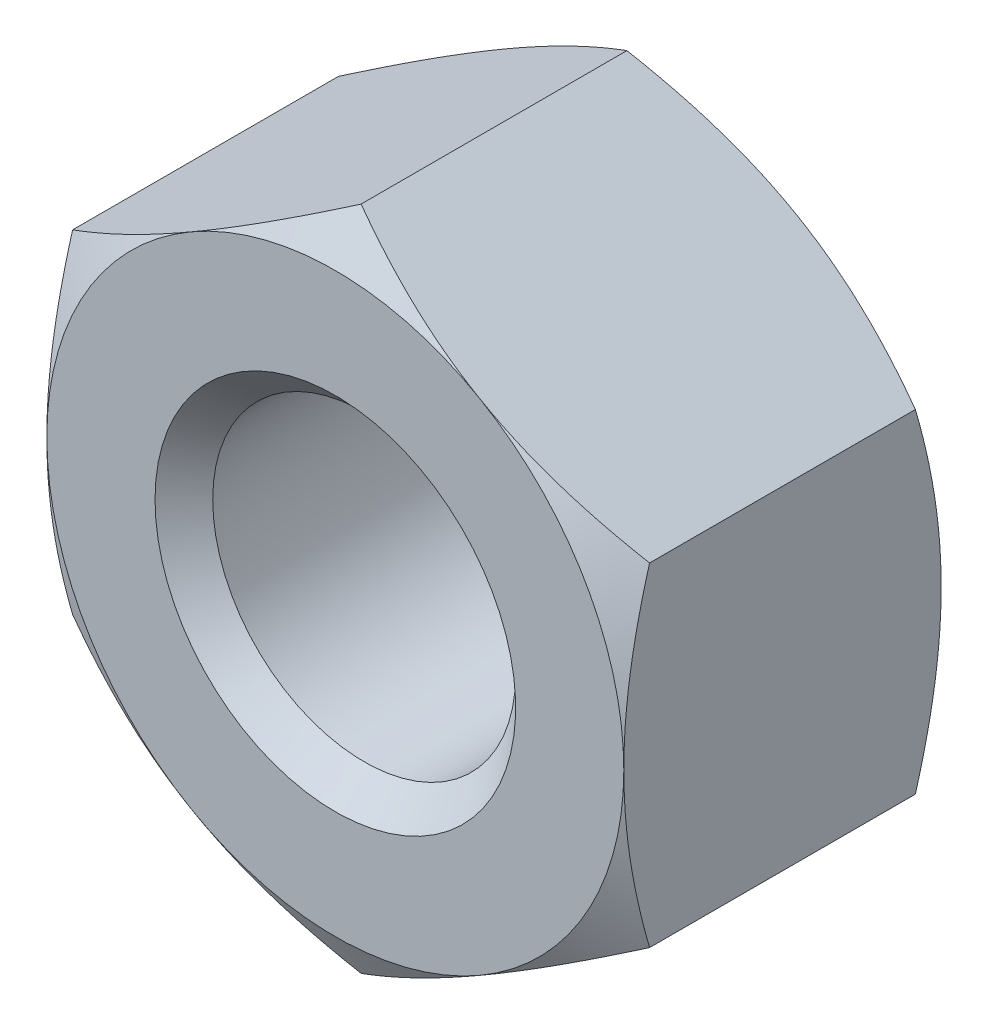
ISO-10303-21;
HEADER;
FILE_DESCRIPTION(('STEP AP214'),'2;1');
FILE_NAME('part.step','',(''),(''),'','','');
FILE_SCHEMA(('AUTOMOTIVE_DESIGN { 1 0 10303 214 1 1 1 1 }'));
ENDSEC;
DATA;
#1=APPLICATION_CONTEXT('core data for automotive mechanical design processes');
#2=APPLICATION_PROTOCOL_DEFINITION('international standard','automotive_design',2000,#1);
#3=PRODUCT_CONTEXT('',#1,'mechanical');
#4=PRODUCT('Part','Part','',(#3));
#5=PRODUCT_RELATED_PRODUCT_CATEGORY('part','',(#4));
#6=PRODUCT_DEFINITION_FORMATION('','',#4);
#7=PRODUCT_DEFINITION_CONTEXT('part definition',#1,'design');
#8=PRODUCT_DEFINITION('design','',#6,#7);
#9=PRODUCT_DEFINITION_SHAPE('','',#8);
#10=(LENGTH_UNIT() NAMED_UNIT(*) SI_UNIT(.MILLI.,.METRE.));
#11=(NAMED_UNIT(*) PLANE_ANGLE_UNIT() SI_UNIT($,.RADIAN.));
#12=(NAMED_UNIT(*) SI_UNIT($,.STERADIAN.) SOLID_ANGLE_UNIT());
#13=UNCERTAINTY_MEASURE_WITH_UNIT(LENGTH_MEASURE(1.E-05),#10,'distance_accuracy_value','');
#14=(GEOMETRIC_REPRESENTATION_CONTEXT(3) GLOBAL_UNCERTAINTY_ASSIGNED_CONTEXT((#13)) GLOBAL_UNIT_ASSIGNED_CONTEXT((#10,
#11,#12)) REPRESENTATION_CONTEXT('',''));
#15=CARTESIAN_POINT('',(0.,0.,0.));
#16=DIRECTION('',(0.,0.,1.));
#17=DIRECTION('',(1.,0.,0.));
#18=AXIS2_PLACEMENT_3D('',#15,#16,#17);
#19=CARTESIAN_POINT('',(0.,0.,0.));
#20=DIRECTION('',(0.,0.,1.));
#21=DIRECTION('',(-1.,0.,0.));
#22=AXIS2_PLACEMENT_3D('',#19,#20,#21);
#23=CONICAL_SURFACE('',#22,4.,1.0471975511966);
#24=CARTESIAN_POINT('',(-4.,0.,0.));
#25=CARTESIAN_POINT('',(-4.,1.07179676974714,0.));
#26=CARTESIAN_POINT('',(-4.,2.30940107681485,0.35726558992443));
#27=(BOUNDED_CURVE() B_SPLINE_CURVE(2,(#24,#25,#26),.UNSPECIFIED.,.F.,
.F.) B_SPLINE_CURVE_WITH_KNOTS((3,3),(1.38370732052329,1.88872631328208),
.UNSPECIFIED.) CURVE() GEOMETRIC_REPRESENTATION_ITEM() RATIONAL_B_SPLINE_CURVE((2.16913429510899,
2.16913429510899,2.01339745961497)) REPRESENTATION_ITEM(''));
#28=CARTESIAN_POINT('',(-4.,0.,0.));
#29=VERTEX_POINT('',#28);
#30=CARTESIAN_POINT('',(-4.,2.3094010767585,0.357265589908164));
#31=VERTEX_POINT('',#30);
#32=EDGE_CURVE('E28',#29,#31,#27,.T.);
#33=ORIENTED_EDGE('',*,*,#32,.T.);
#34=CARTESIAN_POINT('',(-3.99999999996844,2.30940107677673,0.357265589897643));
#35=CARTESIAN_POINT('',(-2.92820323026283,2.92820323028283,0.));
#36=CARTESIAN_POINT('',(-2.,3.46410161513775,0.));
#37=(BOUNDED_CURVE() B_SPLINE_CURVE(2,(#34,#35,#36),.UNSPECIFIED.,.F.,
.F.) B_SPLINE_CURVE_WITH_KNOTS((3,3),(0.878688327782084,1.38370732052329),
.UNSPECIFIED.) CURVE() GEOMETRIC_REPRESENTATION_ITEM() RATIONAL_B_SPLINE_CURVE((2.01339745962581,
2.16913429510899,2.16913429510899)) REPRESENTATION_ITEM(''));
#38=CARTESIAN_POINT('',(-2.,3.46410161513775,0.));
#39=VERTEX_POINT('',#38);
#40=EDGE_CURVE('E169',#31,#39,#37,.T.);
#41=ORIENTED_EDGE('',*,*,#40,.T.);
#42=CARTESIAN_POINT('',(0.,0.,0.));
#43=DIRECTION('',(0.,0.,-1.));
#44=DIRECTION('',(-1.,0.,0.));
#45=AXIS2_PLACEMENT_3D('',#42,#43,#44);
#46=CIRCLE('',#45,4.);
#47=EDGE_CURVE('E202',#29,#39,#46,.T.);
#48=ORIENTED_EDGE('',*,*,#47,.F.);
#49=EDGE_LOOP('',(#33,#41,#48));
#50=FACE_BOUND('',#49,.T.);
#51=ADVANCED_FACE('F17',(#50),#23,.T.);
#52=CARTESIAN_POINT('',(0.,0.,0.));
#53=DIRECTION('',(0.,0.,1.));
#54=DIRECTION('',(-1.,0.,0.));
#55=AXIS2_PLACEMENT_3D('',#52,#53,#54);
#56=CONICAL_SURFACE('',#55,4.,1.0471975511966);
#57=CARTESIAN_POINT('',(0.,0.,0.));
#58=DIRECTION('',(0.,0.,-1.));
#59=DIRECTION('',(-1.,0.,0.));
#60=AXIS2_PLACEMENT_3D('',#57,#58,#59);
#61=CIRCLE('',#60,4.);
#62=CARTESIAN_POINT('',(2.,3.46410161513775,0.));
#63=VERTEX_POINT('',#62);
#64=EDGE_CURVE('E246',#39,#63,#61,.T.);
#65=ORIENTED_EDGE('',*,*,#64,.F.);
#66=CARTESIAN_POINT('',(-2.,3.46410161513775,0.));
#67=CARTESIAN_POINT('',(-1.07179676970488,4.00000000001133,0.));
#68=CARTESIAN_POINT('',(4.88062024363408E-11,4.61880215354519,0.357265589924434));
#69=(BOUNDED_CURVE() B_SPLINE_CURVE(2,(#66,#67,#68),.UNSPECIFIED.,.F.,
.F.) B_SPLINE_CURVE_WITH_KNOTS((3,3),(1.38370732052329,1.88872631328208),
.UNSPECIFIED.) CURVE() GEOMETRIC_REPRESENTATION_ITEM() RATIONAL_B_SPLINE_CURVE((2.16913429510899,
2.16913429510899,2.01339745961497)) REPRESENTATION_ITEM(''));
#70=CARTESIAN_POINT('',(0.,4.61880215351701,0.357265589908166));
#71=VERTEX_POINT('',#70);
#72=EDGE_CURVE('E254',#39,#71,#69,.T.);
#73=ORIENTED_EDGE('',*,*,#72,.T.);
#74=CARTESIAN_POINT('',(3.15596208778348E-11,4.61880215349878,0.357265589897645));
#75=CARTESIAN_POINT('',(1.07179676973718,3.99999999999268,0.));
#76=CARTESIAN_POINT('',(2.,3.46410161513775,0.));
#77=(BOUNDED_CURVE() B_SPLINE_CURVE(2,(#74,#75,#76),.UNSPECIFIED.,.F.,
.F.) B_SPLINE_CURVE_WITH_KNOTS((3,3),(0.878688327782082,1.38370732052329),
.UNSPECIFIED.) CURVE() GEOMETRIC_REPRESENTATION_ITEM() RATIONAL_B_SPLINE_CURVE((2.01339745962582,
2.169134295109,2.169134295109)) REPRESENTATION_ITEM(''));
#78=EDGE_CURVE('E345',#71,#63,#77,.T.);
#79=ORIENTED_EDGE('',*,*,#78,.T.);
#80=EDGE_LOOP('',(#65,#73,#79));
#81=FACE_BOUND('',#80,.T.);
#82=ADVANCED_FACE('F597',(#81),#56,.T.);
#83=CARTESIAN_POINT('',(0.,0.,0.));
#84=DIRECTION('',(0.,0.,1.));
#85=DIRECTION('',(-1.,0.,0.));
#86=AXIS2_PLACEMENT_3D('',#83,#84,#85);
#87=CONICAL_SURFACE('',#86,4.,1.0471975511966);
#88=CARTESIAN_POINT('',(0.,0.,0.));
#89=DIRECTION('',(0.,0.,1.));
#90=DIRECTION('',(1.,0.,0.));
#91=AXIS2_PLACEMENT_3D('',#88,#89,#90);
#92=CIRCLE('',#91,4.);
#93=CARTESIAN_POINT('',(4.,0.,0.));
#94=VERTEX_POINT('',#93);
#95=EDGE_CURVE('E253',#94,#63,#92,.T.);
#96=ORIENTED_EDGE('',*,*,#95,.T.);
#97=CARTESIAN_POINT('',(2.,3.46410161513775,0.));
#98=CARTESIAN_POINT('',(2.92820323029512,2.92820323026418,0.));
#99=CARTESIAN_POINT('',(4.0000000000488,2.30940107673033,0.357265589924432));
#100=(BOUNDED_CURVE() B_SPLINE_CURVE(2,(#97,#98,#99),.UNSPECIFIED.,.F.,
.F.) B_SPLINE_CURVE_WITH_KNOTS((3,3),(1.38370732052329,1.88872631328208),
.UNSPECIFIED.) CURVE() GEOMETRIC_REPRESENTATION_ITEM() RATIONAL_B_SPLINE_CURVE((2.169134295109,
2.169134295109,2.01339745961498)) REPRESENTATION_ITEM(''));
#101=CARTESIAN_POINT('',(4.,2.30940107675851,0.357265589908166));
#102=VERTEX_POINT('',#101);
#103=EDGE_CURVE('E353',#63,#102,#100,.T.);
#104=ORIENTED_EDGE('',*,*,#103,.T.);
#105=CARTESIAN_POINT('',(4.,0.,0.));
#106=CARTESIAN_POINT('',(4.,1.07179676974714,0.));
#107=CARTESIAN_POINT('',(4.,2.30940107681485,0.357265589924431));
#108=(BOUNDED_CURVE() B_SPLINE_CURVE(2,(#105,#106,#107),.UNSPECIFIED.,.F.,
.F.) B_SPLINE_CURVE_WITH_KNOTS((3,3),(1.38370732052329,1.88872631328208),
.UNSPECIFIED.) CURVE() GEOMETRIC_REPRESENTATION_ITEM() RATIONAL_B_SPLINE_CURVE((2.16913429510899,
2.16913429510899,2.01339745961497)) REPRESENTATION_ITEM(''));
#109=EDGE_CURVE('E189',#94,#102,#108,.T.);
#110=ORIENTED_EDGE('',*,*,#109,.F.);
#111=EDGE_LOOP('',(#96,#104,#110));
#112=FACE_BOUND('',#111,.T.);
#113=ADVANCED_FACE('F19',(#112),#87,.T.);
#114=CARTESIAN_POINT('',(0.,0.,0.));
#115=DIRECTION('',(0.,0.,1.));
#116=DIRECTION('',(-1.,0.,0.));
#117=AXIS2_PLACEMENT_3D('',#114,#115,#116);
#118=CONICAL_SURFACE('',#117,4.,1.0471975511966);
#119=CARTESIAN_POINT('',(4.,-2.30940107672206,0.357265589897646));
#120=CARTESIAN_POINT('',(4.,-1.07179676970984,0.));
#121=CARTESIAN_POINT('',(4.,0.,0.));
#122=(BOUNDED_CURVE() B_SPLINE_CURVE(2,(#119,#120,#121),.UNSPECIFIED.,.F.,
.F.) B_SPLINE_CURVE_WITH_KNOTS((3,3),(0.878688327782082,1.38370732052329),
.UNSPECIFIED.) CURVE() GEOMETRIC_REPRESENTATION_ITEM() RATIONAL_B_SPLINE_CURVE((2.01339745962581,
2.16913429510899,2.16913429510899)) REPRESENTATION_ITEM(''));
#123=CARTESIAN_POINT('',(4.,-2.30940107675851,0.357265589908166));
#124=VERTEX_POINT('',#123);
#125=EDGE_CURVE('E195',#124,#94,#122,.T.);
#126=ORIENTED_EDGE('',*,*,#125,.F.);
#127=CARTESIAN_POINT('',(3.99999999996844,-2.30940107677673,0.357265589897642));
#128=CARTESIAN_POINT('',(2.92820323026283,-2.92820323028283,0.));
#129=CARTESIAN_POINT('',(2.,-3.46410161513775,0.));
#130=(BOUNDED_CURVE() B_SPLINE_CURVE(2,(#127,#128,#129),.UNSPECIFIED.,.F.,
.F.) B_SPLINE_CURVE_WITH_KNOTS((3,3),(0.878688327782084,1.38370732052329),
.UNSPECIFIED.) CURVE() GEOMETRIC_REPRESENTATION_ITEM() RATIONAL_B_SPLINE_CURVE((2.01339745962581,
2.16913429510899,2.16913429510899)) REPRESENTATION_ITEM(''));
#131=CARTESIAN_POINT('',(2.,-3.46410161513775,0.));
#132=VERTEX_POINT('',#131);
#133=EDGE_CURVE('E237',#124,#132,#130,.T.);
#134=ORIENTED_EDGE('',*,*,#133,.T.);
#135=CARTESIAN_POINT('',(0.,0.,0.));
#136=DIRECTION('',(0.,0.,-1.));
#137=DIRECTION('',(-1.,0.,0.));
#138=AXIS2_PLACEMENT_3D('',#135,#136,#137);
#139=CIRCLE('',#138,4.);
#140=EDGE_CURVE('E267',#94,#132,#139,.T.);
#141=ORIENTED_EDGE('',*,*,#140,.F.);
#142=EDGE_LOOP('',(#126,#134,#141));
#143=FACE_BOUND('',#142,.T.);
#144=ADVANCED_FACE('F605',(#143),#118,.T.);
#145=CARTESIAN_POINT('',(0.,0.,0.));
#146=DIRECTION('',(0.,0.,1.));
#147=DIRECTION('',(-1.,0.,0.));
#148=AXIS2_PLACEMENT_3D('',#145,#146,#147);
#149=CONICAL_SURFACE('',#148,4.,1.0471975511966);
#150=CARTESIAN_POINT('',(0.,0.,0.));
#151=DIRECTION('',(0.,0.,-1.));
#152=DIRECTION('',(-1.,0.,0.));
#153=AXIS2_PLACEMENT_3D('',#150,#151,#152);
#154=CIRCLE('',#153,4.);
#155=CARTESIAN_POINT('',(-2.,-3.46410161513775,0.));
#156=VERTEX_POINT('',#155);
#157=EDGE_CURVE('E321',#132,#156,#154,.T.);
#158=ORIENTED_EDGE('',*,*,#157,.F.);
#159=CARTESIAN_POINT('',(2.,-3.46410161513775,0.));
#160=CARTESIAN_POINT('',(1.07179676970488,-4.00000000001133,0.));
#161=CARTESIAN_POINT('',(-4.8809510942625E-11,-4.61880215354519,0.357265589924435));
#162=(BOUNDED_CURVE() B_SPLINE_CURVE(2,(#159,#160,#161),.UNSPECIFIED.,.F.,
.F.) B_SPLINE_CURVE_WITH_KNOTS((3,3),(1.38370732052329,1.88872631328208),
.UNSPECIFIED.) CURVE() GEOMETRIC_REPRESENTATION_ITEM() RATIONAL_B_SPLINE_CURVE((2.16913429510899,
2.16913429510899,2.01339745961497)) REPRESENTATION_ITEM(''));
#163=CARTESIAN_POINT('',(0.,-4.61880215351701,0.357265589908166));
#164=VERTEX_POINT('',#163);
#165=EDGE_CURVE('E217',#132,#164,#162,.T.);
#166=ORIENTED_EDGE('',*,*,#165,.T.);
#167=CARTESIAN_POINT('',(-3.15691052625162E-11,-4.61880215349878,0.357265589897643));
#168=CARTESIAN_POINT('',(-1.07179676973718,-3.99999999999268,0.));
#169=CARTESIAN_POINT('',(-2.,-3.46410161513776,0.));
#170=(BOUNDED_CURVE() B_SPLINE_CURVE(2,(#167,#168,#169),.UNSPECIFIED.,.F.,
.F.) B_SPLINE_CURVE_WITH_KNOTS((3,3),(0.878688327782084,1.38370732052329),
.UNSPECIFIED.) CURVE() GEOMETRIC_REPRESENTATION_ITEM() RATIONAL_B_SPLINE_CURVE((2.01339745962581,
2.16913429510899,2.16913429510899)) REPRESENTATION_ITEM(''));
#171=EDGE_CURVE('E274',#164,#156,#170,.T.);
#172=ORIENTED_EDGE('',*,*,#171,.T.);
#173=EDGE_LOOP('',(#158,#166,#172));
#174=FACE_BOUND('',#173,.T.);
#175=ADVANCED_FACE('F591',(#174),#149,.T.);
#176=CARTESIAN_POINT('',(0.,0.,0.));
#177=DIRECTION('',(0.,0.,1.));
#178=DIRECTION('',(-1.,0.,0.));
#179=AXIS2_PLACEMENT_3D('',#176,#177,#178);
#180=CONICAL_SURFACE('',#179,4.,1.0471975511966);
#181=CARTESIAN_POINT('',(0.,0.,0.));
#182=DIRECTION('',(0.,0.,-1.));
#183=DIRECTION('',(-1.,0.,0.));
#184=AXIS2_PLACEMENT_3D('',#181,#182,#183);
#185=CIRCLE('',#184,4.);
#186=EDGE_CURVE('E325',#156,#29,#185,.T.);
#187=ORIENTED_EDGE('',*,*,#186,.F.);
#188=CARTESIAN_POINT('',(-2.,-3.46410161513776,0.));
#189=CARTESIAN_POINT('',(-2.92820323029513,-2.92820323026418,0.));
#190=CARTESIAN_POINT('',(-4.00000000004881,-2.30940107673033,0.357265589924434));
#191=(BOUNDED_CURVE() B_SPLINE_CURVE(2,(#188,#189,#190),.UNSPECIFIED.,.F.,
.F.) B_SPLINE_CURVE_WITH_KNOTS((3,3),(1.38370732052329,1.88872631328208),
.UNSPECIFIED.) CURVE() GEOMETRIC_REPRESENTATION_ITEM() RATIONAL_B_SPLINE_CURVE((2.16913429510899,
2.16913429510899,2.01339745961497)) REPRESENTATION_ITEM(''));
#192=CARTESIAN_POINT('',(-4.,-2.30940107675851,0.357265589908166));
#193=VERTEX_POINT('',#192);
#194=EDGE_CURVE('E281',#156,#193,#191,.T.);
#195=ORIENTED_EDGE('',*,*,#194,.T.);
#196=CARTESIAN_POINT('',(-4.,-2.30940107672206,0.357265589897645));
#197=CARTESIAN_POINT('',(-4.,-1.07179676970984,0.));
#198=CARTESIAN_POINT('',(-4.,0.,0.));
#199=(BOUNDED_CURVE() B_SPLINE_CURVE(2,(#196,#197,#198),.UNSPECIFIED.,.F.,
.F.) B_SPLINE_CURVE_WITH_KNOTS((3,3),(0.878688327782083,1.38370732052329),
.UNSPECIFIED.) CURVE() GEOMETRIC_REPRESENTATION_ITEM() RATIONAL_B_SPLINE_CURVE((2.01339745962581,
2.16913429510899,2.16913429510899)) REPRESENTATION_ITEM(''));
#200=EDGE_CURVE('E11',#193,#29,#199,.T.);
#201=ORIENTED_EDGE('',*,*,#200,.T.);
#202=EDGE_LOOP('',(#187,#195,#201));
#203=FACE_BOUND('',#202,.T.);
#204=ADVANCED_FACE('F583',(#203),#180,.T.);
#205=CARTESIAN_POINT('',(0.,0.,4.4));
#206=DIRECTION('',(0.,0.,-1.));
#207=DIRECTION('',(1.,0.,0.));
#208=AXIS2_PLACEMENT_3D('',#205,#206,#207);
#209=CONICAL_SURFACE('',#208,4.,1.0471975511966);
#210=CARTESIAN_POINT('',(-2.,-3.46410161513776,4.4));
#211=CARTESIAN_POINT('',(-2.92820323026282,-2.92820323028284,4.4));
#212=CARTESIAN_POINT('',(-3.99999999996844,-2.30940107677673,4.04273441010236));
#213=(BOUNDED_CURVE() B_SPLINE_CURVE(2,(#210,#211,#212),.UNSPECIFIED.,.F.,
.F.) B_SPLINE_CURVE_WITH_KNOTS((3,3),(-1.3837073205233,-0.878688327782084),
.UNSPECIFIED.) CURVE() GEOMETRIC_REPRESENTATION_ITEM() RATIONAL_B_SPLINE_CURVE((2.16913429510899,
2.16913429510899,2.01339745962581)) REPRESENTATION_ITEM(''));
#214=CARTESIAN_POINT('',(-2.,-3.46410161513775,4.4));
#215=VERTEX_POINT('',#214);
#216=CARTESIAN_POINT('',(-4.,-2.30940107675851,4.04273441009184));
#217=VERTEX_POINT('',#216);
#218=EDGE_CURVE('E273',#215,#217,#213,.T.);
#219=ORIENTED_EDGE('',*,*,#218,.F.);
#220=CARTESIAN_POINT('',(0.,0.,4.4));
#221=DIRECTION('',(0.,0.,1.));
#222=DIRECTION('',(-1.,0.,0.));
#223=AXIS2_PLACEMENT_3D('',#220,#221,#222);
#224=CIRCLE('',#223,4.);
#225=CARTESIAN_POINT('',(-4.,0.,4.4));
#226=VERTEX_POINT('',#225);
#227=EDGE_CURVE('E218',#226,#215,#224,.T.);
#228=ORIENTED_EDGE('',*,*,#227,.F.);
#229=CARTESIAN_POINT('',(-4.,-2.30940107681487,4.04273441007556));
#230=CARTESIAN_POINT('',(-4.,-1.07179676974715,4.4));
#231=CARTESIAN_POINT('',(-4.,0.,4.4));
#232=(BOUNDED_CURVE() B_SPLINE_CURVE(2,(#229,#230,#231),.UNSPECIFIED.,.F.,
.F.) B_SPLINE_CURVE_WITH_KNOTS((3,3),(-1.88872631328208,-1.3837073205233),
.UNSPECIFIED.) CURVE() GEOMETRIC_REPRESENTATION_ITEM() RATIONAL_B_SPLINE_CURVE((2.01339745961497,
2.16913429510899,2.16913429510899)) REPRESENTATION_ITEM(''));
#233=EDGE_CURVE('E150',#217,#226,#232,.T.);
#234=ORIENTED_EDGE('',*,*,#233,.F.);
#235=EDGE_LOOP('',(#219,#228,#234));
#236=FACE_BOUND('',#235,.T.);
#237=ADVANCED_FACE('F580',(#236),#209,.T.);
#238=CARTESIAN_POINT('',(0.,0.,4.4));
#239=DIRECTION('',(0.,0.,-1.));
#240=DIRECTION('',(1.,0.,0.));
#241=AXIS2_PLACEMENT_3D('',#238,#239,#240);
#242=CONICAL_SURFACE('',#241,4.,1.0471975511966);
#243=CARTESIAN_POINT('',(2.,-3.46410161513776,4.4));
#244=CARTESIAN_POINT('',(1.07179676973717,-3.99999999999268,4.4));
#245=CARTESIAN_POINT('',(3.15571946398931E-11,-4.61880215349879,4.04273441010235));
#246=(BOUNDED_CURVE() B_SPLINE_CURVE(2,(#243,#244,#245),.UNSPECIFIED.,.F.,
.F.) B_SPLINE_CURVE_WITH_KNOTS((3,3),(-1.38370732052329,-0.878688327782081),
.UNSPECIFIED.) CURVE() GEOMETRIC_REPRESENTATION_ITEM() RATIONAL_B_SPLINE_CURVE((2.16913429510899,
2.16913429510899,2.01339745962581)) REPRESENTATION_ITEM(''));
#247=CARTESIAN_POINT('',(2.,-3.46410161513775,4.4));
#248=VERTEX_POINT('',#247);
#249=CARTESIAN_POINT('',(0.,-4.61880215351701,4.04273441009184));
#250=VERTEX_POINT('',#249);
#251=EDGE_CURVE('E204',#248,#250,#246,.T.);
#252=ORIENTED_EDGE('',*,*,#251,.F.);
#253=CARTESIAN_POINT('',(0.,0.,4.4));
#254=DIRECTION('',(0.,0.,1.));
#255=DIRECTION('',(-1.,0.,0.));
#256=AXIS2_PLACEMENT_3D('',#253,#254,#255);
#257=CIRCLE('',#256,4.);
#258=EDGE_CURVE('E21',#215,#248,#257,.T.);
#259=ORIENTED_EDGE('',*,*,#258,.F.);
#260=CARTESIAN_POINT('',(4.87976003200018E-11,-4.61880215354518,4.04273441007557));
#261=CARTESIAN_POINT('',(-1.07179676970488,-4.00000000001133,4.4));
#262=CARTESIAN_POINT('',(-2.,-3.46410161513776,4.4));
#263=(BOUNDED_CURVE() B_SPLINE_CURVE(2,(#260,#261,#262),.UNSPECIFIED.,.F.,
.F.) B_SPLINE_CURVE_WITH_KNOTS((3,3),(-1.88872631328208,-1.3837073205233),
.UNSPECIFIED.) CURVE() GEOMETRIC_REPRESENTATION_ITEM() RATIONAL_B_SPLINE_CURVE((2.01339745961497,
2.16913429510899,2.16913429510899)) REPRESENTATION_ITEM(''));
#264=EDGE_CURVE('E245',#250,#215,#263,.T.);
#265=ORIENTED_EDGE('',*,*,#264,.F.);
#266=EDGE_LOOP('',(#252,#259,#265));
#267=FACE_BOUND('',#266,.T.);
#268=ADVANCED_FACE('F582',(#267),#242,.T.);
#269=CARTESIAN_POINT('',(0.,0.,4.4));
#270=DIRECTION('',(0.,0.,-1.));
#271=DIRECTION('',(1.,0.,0.));
#272=AXIS2_PLACEMENT_3D('',#269,#270,#271);
#273=CONICAL_SURFACE('',#272,4.,1.0471975511966);
#274=CARTESIAN_POINT('',(4.0000000000488,-2.30940107673033,4.04273441007557));
#275=CARTESIAN_POINT('',(2.92820323029512,-2.92820323026419,4.4));
#276=CARTESIAN_POINT('',(2.,-3.46410161513776,4.4));
#277=(BOUNDED_CURVE() B_SPLINE_CURVE(2,(#274,#275,#276),.UNSPECIFIED.,.F.,
.F.) B_SPLINE_CURVE_WITH_KNOTS((3,3),(-1.88872631328208,-1.38370732052329),
.UNSPECIFIED.) CURVE() GEOMETRIC_REPRESENTATION_ITEM() RATIONAL_B_SPLINE_CURVE((2.01339745961497,
2.16913429510899,2.16913429510899)) REPRESENTATION_ITEM(''));
#278=CARTESIAN_POINT('',(4.,-2.30940107675851,4.04273441009184));
#279=VERTEX_POINT('',#278);
#280=EDGE_CURVE('E180',#279,#248,#277,.T.);
#281=ORIENTED_EDGE('',*,*,#280,.F.);
#282=CARTESIAN_POINT('',(4.,-2.30940107681485,4.04273441007557));
#283=CARTESIAN_POINT('',(4.,-1.07179676974714,4.4));
#284=CARTESIAN_POINT('',(4.,0.,4.4));
#285=(BOUNDED_CURVE() B_SPLINE_CURVE(2,(#282,#283,#284),.UNSPECIFIED.,.F.,
.F.) B_SPLINE_CURVE_WITH_KNOTS((3,3),(-1.88872631328208,-1.3837073205233),
.UNSPECIFIED.) CURVE() GEOMETRIC_REPRESENTATION_ITEM() RATIONAL_B_SPLINE_CURVE((2.01339745961497,
2.16913429510899,2.16913429510899)) REPRESENTATION_ITEM(''));
#286=CARTESIAN_POINT('',(4.,0.,4.4));
#287=VERTEX_POINT('',#286);
#288=EDGE_CURVE('E223',#279,#287,#285,.T.);
#289=ORIENTED_EDGE('',*,*,#288,.T.);
#290=CARTESIAN_POINT('',(0.,0.,4.4));
#291=DIRECTION('',(0.,0.,1.));
#292=DIRECTION('',(-1.,0.,0.));
#293=AXIS2_PLACEMENT_3D('',#290,#291,#292);
#294=CIRCLE('',#293,4.);
#295=EDGE_CURVE('E320',#248,#287,#294,.T.);
#296=ORIENTED_EDGE('',*,*,#295,.F.);
#297=EDGE_LOOP('',(#281,#289,#296));
#298=FACE_BOUND('',#297,.T.);
#299=ADVANCED_FACE('F390',(#298),#273,.T.);
#300=CARTESIAN_POINT('',(0.,0.,4.4));
#301=DIRECTION('',(0.,0.,-1.));
#302=DIRECTION('',(1.,0.,0.));
#303=AXIS2_PLACEMENT_3D('',#300,#301,#302);
#304=CONICAL_SURFACE('',#303,4.,1.0471975511966);
#305=CARTESIAN_POINT('',(2.,3.46410161513775,4.4));
#306=CARTESIAN_POINT('',(2.92820323026283,2.92820323028283,4.4));
#307=CARTESIAN_POINT('',(3.99999999996844,2.30940107677672,4.04273441010236));
#308=(BOUNDED_CURVE() B_SPLINE_CURVE(2,(#305,#306,#307),.UNSPECIFIED.,.F.,
.F.) B_SPLINE_CURVE_WITH_KNOTS((3,3),(-1.38370732052329,-0.878688327782083),
.UNSPECIFIED.) CURVE() GEOMETRIC_REPRESENTATION_ITEM() RATIONAL_B_SPLINE_CURVE((2.16913429510899,
2.16913429510899,2.01339745962581)) REPRESENTATION_ITEM(''));
#309=CARTESIAN_POINT('',(2.,3.46410161513775,4.4));
#310=VERTEX_POINT('',#309);
#311=CARTESIAN_POINT('',(4.,2.30940107675851,4.04273441009184));
#312=VERTEX_POINT('',#311);
#313=EDGE_CURVE('E300',#310,#312,#308,.T.);
#314=ORIENTED_EDGE('',*,*,#313,.F.);
#315=CARTESIAN_POINT('',(0.,0.,4.4));
#316=DIRECTION('',(0.,0.,1.));
#317=DIRECTION('',(1.,0.,0.));
#318=AXIS2_PLACEMENT_3D('',#315,#316,#317);
#319=CIRCLE('',#318,4.);
#320=EDGE_CURVE('E316',#287,#310,#319,.T.);
#321=ORIENTED_EDGE('',*,*,#320,.F.);
#322=CARTESIAN_POINT('',(4.,0.,4.4));
#323=CARTESIAN_POINT('',(4.,1.07179676970984,4.4));
#324=CARTESIAN_POINT('',(4.,2.30940107672206,4.04273441010236));
#325=(BOUNDED_CURVE() B_SPLINE_CURVE(2,(#322,#323,#324),.UNSPECIFIED.,.F.,
.F.) B_SPLINE_CURVE_WITH_KNOTS((3,3),(-1.3837073205233,-0.878688327782082),
.UNSPECIFIED.) CURVE() GEOMETRIC_REPRESENTATION_ITEM() RATIONAL_B_SPLINE_CURVE((2.16913429510899,
2.16913429510899,2.01339745962581)) REPRESENTATION_ITEM(''));
#326=EDGE_CURVE('E194',#287,#312,#325,.T.);
#327=ORIENTED_EDGE('',*,*,#326,.T.);
#328=EDGE_LOOP('',(#314,#321,#327));
#329=FACE_BOUND('',#328,.T.);
#330=ADVANCED_FACE('F612',(#329),#304,.T.);
#331=CARTESIAN_POINT('',(0.,0.,4.4));
#332=DIRECTION('',(0.,0.,-1.));
#333=DIRECTION('',(1.,0.,0.));
#334=AXIS2_PLACEMENT_3D('',#331,#332,#333);
#335=CONICAL_SURFACE('',#334,4.,1.0471975511966);
#336=CARTESIAN_POINT('',(-2.,3.46410161513776,4.4));
#337=CARTESIAN_POINT('',(-1.07179676973718,3.99999999999268,4.4));
#338=CARTESIAN_POINT('',(-3.15642527866327E-11,4.61880215349879,4.04273441010236));
#339=(BOUNDED_CURVE() B_SPLINE_CURVE(2,(#336,#337,#338),.UNSPECIFIED.,.F.,
.F.) B_SPLINE_CURVE_WITH_KNOTS((3,3),(-1.38370732052329,-0.878688327782083),
.UNSPECIFIED.) CURVE() GEOMETRIC_REPRESENTATION_ITEM() RATIONAL_B_SPLINE_CURVE((2.16913429510899,
2.16913429510899,2.01339745962581)) REPRESENTATION_ITEM(''));
#340=CARTESIAN_POINT('',(-2.,3.46410161513775,4.4));
#341=VERTEX_POINT('',#340);
#342=CARTESIAN_POINT('',(0.,4.61880215351701,4.04273441009184));
#343=VERTEX_POINT('',#342);
#344=EDGE_CURVE('E164',#341,#343,#339,.T.);
#345=ORIENTED_EDGE('',*,*,#344,.F.);
#346=CARTESIAN_POINT('',(0.,0.,4.4));
#347=DIRECTION('',(0.,0.,1.));
#348=DIRECTION('',(-1.,0.,0.));
#349=AXIS2_PLACEMENT_3D('',#346,#347,#348);
#350=CIRCLE('',#349,4.);
#351=EDGE_CURVE('E176',#310,#341,#350,.T.);
#352=ORIENTED_EDGE('',*,*,#351,.F.);
#353=CARTESIAN_POINT('',(-4.87907627403477E-11,4.61880215354518,4.04273441007557));
#354=CARTESIAN_POINT('',(1.07179676970488,4.00000000001132,4.4));
#355=CARTESIAN_POINT('',(2.,3.46410161513775,4.4));
#356=(BOUNDED_CURVE() B_SPLINE_CURVE(2,(#353,#354,#355),.UNSPECIFIED.,.F.,
.F.) B_SPLINE_CURVE_WITH_KNOTS((3,3),(-1.88872631328208,-1.38370732052329),
.UNSPECIFIED.) CURVE() GEOMETRIC_REPRESENTATION_ITEM() RATIONAL_B_SPLINE_CURVE((2.01339745961497,
2.16913429510899,2.16913429510899)) REPRESENTATION_ITEM(''));
#357=EDGE_CURVE('E310',#343,#310,#356,.T.);
#358=ORIENTED_EDGE('',*,*,#357,.F.);
#359=EDGE_LOOP('',(#345,#352,#358));
#360=FACE_BOUND('',#359,.T.);
#361=ADVANCED_FACE('F637',(#360),#335,.T.);
#362=CARTESIAN_POINT('',(0.,0.,4.4));
#363=DIRECTION('',(0.,0.,-1.));
#364=DIRECTION('',(1.,0.,0.));
#365=AXIS2_PLACEMENT_3D('',#362,#363,#364);
#366=CONICAL_SURFACE('',#365,4.,1.0471975511966);
#367=CARTESIAN_POINT('',(-4.0000000000488,2.30940107673033,4.04273441007557));
#368=CARTESIAN_POINT('',(-2.92820323029512,2.92820323026419,4.4));
#369=CARTESIAN_POINT('',(-2.,3.46410161513776,4.4));
#370=(BOUNDED_CURVE() B_SPLINE_CURVE(2,(#367,#368,#369),.UNSPECIFIED.,.F.,
.F.) B_SPLINE_CURVE_WITH_KNOTS((3,3),(-1.88872631328208,-1.38370732052329),
.UNSPECIFIED.) CURVE() GEOMETRIC_REPRESENTATION_ITEM() RATIONAL_B_SPLINE_CURVE((2.01339745961497,
2.16913429510899,2.16913429510899)) REPRESENTATION_ITEM(''));
#371=CARTESIAN_POINT('',(-4.,2.30940107675851,4.04273441009184));
#372=VERTEX_POINT('',#371);
#373=EDGE_CURVE('E157',#372,#341,#370,.T.);
#374=ORIENTED_EDGE('',*,*,#373,.F.);
#375=CARTESIAN_POINT('',(-4.,0.,4.4));
#376=CARTESIAN_POINT('',(-4.,1.07179676970984,4.4));
#377=CARTESIAN_POINT('',(-4.,2.30940107672206,4.04273441010236));
#378=(BOUNDED_CURVE() B_SPLINE_CURVE(2,(#375,#376,#377),.UNSPECIFIED.,.F.,
.F.) B_SPLINE_CURVE_WITH_KNOTS((3,3),(-1.3837073205233,-0.878688327782082),
.UNSPECIFIED.) CURVE() GEOMETRIC_REPRESENTATION_ITEM() RATIONAL_B_SPLINE_CURVE((2.16913429510899,
2.16913429510899,2.01339745962581)) REPRESENTATION_ITEM(''));
#379=EDGE_CURVE('E145',#226,#372,#378,.T.);
#380=ORIENTED_EDGE('',*,*,#379,.F.);
#381=CARTESIAN_POINT('',(0.,0.,4.4));
#382=DIRECTION('',(0.,0.,1.));
#383=DIRECTION('',(-1.,0.,0.));
#384=AXIS2_PLACEMENT_3D('',#381,#382,#383);
#385=CIRCLE('',#384,4.);
#386=EDGE_CURVE('E159',#341,#226,#385,.T.);
#387=ORIENTED_EDGE('',*,*,#386,.F.);
#388=EDGE_LOOP('',(#374,#380,#387));
#389=FACE_BOUND('',#388,.T.);
#390=ADVANCED_FACE('F158',(#389),#366,.T.);
#391=CARTESIAN_POINT('',(-4.,2.3094010767585,4.4));
#392=DIRECTION('',(1.,0.,0.));
#393=DIRECTION('',(0.,1.,0.));
#394=AXIS2_PLACEMENT_3D('',#391,#392,#393);
#395=PLANE('',#394);
#396=DIRECTION('',(0.,0.,-1.));
#397=VECTOR('',#396,1.);
#398=CARTESIAN_POINT('',(-4.,-2.30940107675851,4.04273441009184));
#399=LINE('',#398,#397);
#400=EDGE_CURVE('E554',#217,#193,#399,.T.);
#401=ORIENTED_EDGE('',*,*,#400,.F.);
#402=ORIENTED_EDGE('',*,*,#233,.T.);
#403=ORIENTED_EDGE('',*,*,#379,.T.);
#404=DIRECTION('',(0.,0.,-1.));
#405=VECTOR('',#404,1.);
#406=CARTESIAN_POINT('',(-4.,2.3094010767585,4.04273441009184));
#407=LINE('',#406,#405);
#408=EDGE_CURVE('E149',#372,#31,#407,.T.);
#409=ORIENTED_EDGE('',*,*,#408,.T.);
#410=ORIENTED_EDGE('',*,*,#32,.F.);
#411=ORIENTED_EDGE('',*,*,#200,.F.);
#412=EDGE_LOOP('',(#401,#402,#403,#409,#410,#411));
#413=FACE_BOUND('',#412,.T.);
#414=ADVANCED_FACE('F147',(#413),#395,.F.);
#415=CARTESIAN_POINT('',(-4.,-2.30940107675851,4.4));
#416=DIRECTION('',(0.5,0.866025403784439,0.));
#417=DIRECTION('',(0.,0.,-1.));
#418=AXIS2_PLACEMENT_3D('',#415,#416,#417);
#419=PLANE('',#418);
#420=DIRECTION('',(0.,0.,-1.));
#421=VECTOR('',#420,1.);
#422=CARTESIAN_POINT('',(0.,-4.61880215351701,4.04273441009184));
#423=LINE('',#422,#421);
#424=EDGE_CURVE('E210',#250,#164,#423,.T.);
#425=ORIENTED_EDGE('',*,*,#424,.F.);
#426=ORIENTED_EDGE('',*,*,#264,.T.);
#427=ORIENTED_EDGE('',*,*,#218,.T.);
#428=ORIENTED_EDGE('',*,*,#400,.T.);
#429=ORIENTED_EDGE('',*,*,#194,.F.);
#430=ORIENTED_EDGE('',*,*,#171,.F.);
#431=EDGE_LOOP('',(#425,#426,#427,#428,#429,#430));
#432=FACE_BOUND('',#431,.T.);
#433=ADVANCED_FACE('F577',(#432),#419,.F.);
#434=CARTESIAN_POINT('',(0.,-4.61880215351701,4.4));
#435=DIRECTION('',(-0.5,0.866025403784439,0.));
#436=DIRECTION('',(0.,0.,1.));
#437=AXIS2_PLACEMENT_3D('',#434,#435,#436);
#438=PLANE('',#437);
#439=DIRECTION('',(0.,0.,-1.));
#440=VECTOR('',#439,1.);
#441=CARTESIAN_POINT('',(4.,-2.30940107675851,4.04273441009184));
#442=LINE('',#441,#440);
#443=EDGE_CURVE('E228',#279,#124,#442,.T.);
#444=ORIENTED_EDGE('',*,*,#443,.F.);
#445=ORIENTED_EDGE('',*,*,#280,.T.);
#446=ORIENTED_EDGE('',*,*,#251,.T.);
#447=ORIENTED_EDGE('',*,*,#424,.T.);
#448=ORIENTED_EDGE('',*,*,#165,.F.);
#449=ORIENTED_EDGE('',*,*,#133,.F.);
#450=EDGE_LOOP('',(#444,#445,#446,#447,#448,#449));
#451=FACE_BOUND('',#450,.T.);
#452=ADVANCED_FACE('F386',(#451),#438,.F.);
#453=CARTESIAN_POINT('',(4.,2.3094010767585,4.4));
#454=DIRECTION('',(1.,0.,0.));
#455=DIRECTION('',(0.,1.,0.));
#456=AXIS2_PLACEMENT_3D('',#453,#454,#455);
#457=PLANE('',#456);
#458=ORIENTED_EDGE('',*,*,#125,.T.);
#459=ORIENTED_EDGE('',*,*,#109,.T.);
#460=DIRECTION('',(0.,0.,-1.));
#461=VECTOR('',#460,1.);
#462=CARTESIAN_POINT('',(4.,2.3094010767585,4.04273441009184));
#463=LINE('',#462,#461);
#464=EDGE_CURVE('E309',#312,#102,#463,.T.);
#465=ORIENTED_EDGE('',*,*,#464,.F.);
#466=ORIENTED_EDGE('',*,*,#326,.F.);
#467=ORIENTED_EDGE('',*,*,#288,.F.);
#468=ORIENTED_EDGE('',*,*,#443,.T.);
#469=EDGE_LOOP('',(#458,#459,#465,#466,#467,#468));
#470=FACE_BOUND('',#469,.T.);
#471=ADVANCED_FACE('F615',(#470),#457,.T.);
#472=CARTESIAN_POINT('',(4.,2.3094010767585,4.4));
#473=DIRECTION('',(-0.5,-0.866025403784439,0.));
#474=DIRECTION('',(-0.866025403784439,0.5,0.));
#475=AXIS2_PLACEMENT_3D('',#472,#473,#474);
#476=PLANE('',#475);
#477=DIRECTION('',(0.,0.,-1.));
#478=VECTOR('',#477,1.);
#479=CARTESIAN_POINT('',(0.,4.61880215351701,4.04273441009184));
#480=LINE('',#479,#478);
#481=EDGE_CURVE('E260',#343,#71,#480,.T.);
#482=ORIENTED_EDGE('',*,*,#481,.F.);
#483=ORIENTED_EDGE('',*,*,#357,.T.);
#484=ORIENTED_EDGE('',*,*,#313,.T.);
#485=ORIENTED_EDGE('',*,*,#464,.T.);
#486=ORIENTED_EDGE('',*,*,#103,.F.);
#487=ORIENTED_EDGE('',*,*,#78,.F.);
#488=EDGE_LOOP('',(#482,#483,#484,#485,#486,#487));
#489=FACE_BOUND('',#488,.T.);
#490=ADVANCED_FACE('F618',(#489),#476,.F.);
#491=CARTESIAN_POINT('',(0.,4.61880215351701,4.4));
#492=DIRECTION('',(0.5,-0.866025403784439,0.));
#493=DIRECTION('',(0.,0.,-1.));
#494=AXIS2_PLACEMENT_3D('',#491,#492,#493);
#495=PLANE('',#494);
#496=ORIENTED_EDGE('',*,*,#408,.F.);
#497=ORIENTED_EDGE('',*,*,#373,.T.);
#498=ORIENTED_EDGE('',*,*,#344,.T.);
#499=ORIENTED_EDGE('',*,*,#481,.T.);
#500=ORIENTED_EDGE('',*,*,#72,.F.);
#501=ORIENTED_EDGE('',*,*,#40,.F.);
#502=EDGE_LOOP('',(#496,#497,#498,#499,#500,#501));
#503=FACE_BOUND('',#502,.T.);
#504=ADVANCED_FACE('F167',(#503),#495,.F.);
#505=CARTESIAN_POINT('',(0.,4.61880215351701,4.4));
#506=DIRECTION('',(0.,0.,-1.));
#507=DIRECTION('',(0.,-1.,0.));
#508=AXIS2_PLACEMENT_3D('',#505,#506,#507);
#509=PLANE('',#508);
#510=CARTESIAN_POINT('',(0.,0.,4.4));
#511=DIRECTION('',(0.,0.,-1.));
#512=DIRECTION('',(1.,0.,0.));
#513=AXIS2_PLACEMENT_3D('',#510,#511,#512);
#514=CIRCLE('',#513,2.5);
#515=CARTESIAN_POINT('',(-2.5,0.,4.4));
#516=VERTEX_POINT('',#515);
#517=EDGE_CURVE('E334',#516,#516,#514,.T.);
#518=ORIENTED_EDGE('',*,*,#517,.T.);
#519=EDGE_LOOP('',(#518));
#520=FACE_BOUND('',#519,.T.);
#521=ORIENTED_EDGE('',*,*,#227,.T.);
#522=ORIENTED_EDGE('',*,*,#258,.T.);
#523=ORIENTED_EDGE('',*,*,#295,.T.);
#524=ORIENTED_EDGE('',*,*,#320,.T.);
#525=ORIENTED_EDGE('',*,*,#351,.T.);
#526=ORIENTED_EDGE('',*,*,#386,.T.);
#527=EDGE_LOOP('',(#521,#522,#523,#524,#525,#526));
#528=FACE_BOUND('',#527,.T.);
#529=ADVANCED_FACE('F396',(#520,#528),#509,.F.);
#530=CARTESIAN_POINT('',(0.,0.,4.2));
#531=DIRECTION('',(0.,0.,1.));
#532=DIRECTION('',(1.,0.,0.));
#533=AXIS2_PLACEMENT_3D('',#530,#531,#532);
#534=CONICAL_SURFACE('',#533,2.3,0.785398163397449);
#535=ORIENTED_EDGE('',*,*,#517,.F.);
#536=DIRECTION('',(0.707106781186548,0.,-0.707106781186547));
#537=VECTOR('',#536,1.);
#538=CARTESIAN_POINT('',(-2.3,0.,4.2));
#539=LINE('',#538,#537);
#540=CARTESIAN_POINT('',(-2.1,0.,4.));
#541=VERTEX_POINT('',#540);
#542=EDGE_CURVE('E222',#516,#541,#539,.T.);
#543=ORIENTED_EDGE('',*,*,#542,.T.);
#544=CARTESIAN_POINT('',(0.,0.,4.));
#545=DIRECTION('',(0.,0.,1.));
#546=DIRECTION('',(1.,0.,0.));
#547=AXIS2_PLACEMENT_3D('',#544,#545,#546);
#548=CIRCLE('',#547,2.1);
#549=EDGE_CURVE('E203',#541,#541,#548,.T.);
#550=ORIENTED_EDGE('',*,*,#549,.F.);
#551=ORIENTED_EDGE('',*,*,#542,.F.);
#552=EDGE_LOOP('',(#535,#543,#550,#551));
#553=FACE_BOUND('',#552,.T.);
#554=ADVANCED_FACE('F621',(#553),#534,.F.);
#555=CARTESIAN_POINT('',(0.,2.92857142857134,-5.36465449840762E-08));
#556=DIRECTION('',(0.,0.,-1.));
#557=DIRECTION('',(0.,-1.,0.));
#558=AXIS2_PLACEMENT_3D('',#555,#556,#557);
#559=PLANE('',#558);
#560=CARTESIAN_POINT('',(0.,0.,-5.36465449840762E-08));
#561=DIRECTION('',(0.,0.,1.));
#562=DIRECTION('',(1.,0.,0.));
#563=AXIS2_PLACEMENT_3D('',#560,#561,#562);
#564=CIRCLE('',#563,2.5);
#565=CARTESIAN_POINT('',(-2.5,0.,-5.36465449840762E-08));
#566=VERTEX_POINT('',#565);
#567=EDGE_CURVE('E329',#566,#566,#564,.T.);
#568=ORIENTED_EDGE('',*,*,#567,.T.);
#569=EDGE_LOOP('',(#568));
#570=FACE_BOUND('',#569,.T.);
#571=ORIENTED_EDGE('',*,*,#47,.T.);
#572=ORIENTED_EDGE('',*,*,#64,.T.);
#573=ORIENTED_EDGE('',*,*,#95,.F.);
#574=ORIENTED_EDGE('',*,*,#140,.T.);
#575=ORIENTED_EDGE('',*,*,#157,.T.);
#576=ORIENTED_EDGE('',*,*,#186,.T.);
#577=EDGE_LOOP('',(#571,#572,#573,#574,#575,#576));
#578=FACE_BOUND('',#577,.T.);
#579=ADVANCED_FACE('F643',(#570,#578),#559,.T.);
#580=CARTESIAN_POINT('',(0.,0.,4.4));
#581=DIRECTION('',(0.,0.,1.));
#582=DIRECTION('',(1.,0.,0.));
#583=AXIS2_PLACEMENT_3D('',#580,#581,#582);
#584=CYLINDRICAL_SURFACE('',#583,2.1);
#585=ORIENTED_EDGE('',*,*,#549,.T.);
#586=DIRECTION('',(0.,0.,-1.));
#587=VECTOR('',#586,1.);
#588=CARTESIAN_POINT('',(-2.1,0.,4.4));
#589=LINE('',#588,#587);
#590=CARTESIAN_POINT('',(-2.1,0.,0.399999946353455));
#591=VERTEX_POINT('',#590);
#592=EDGE_CURVE('E196',#541,#591,#589,.T.);
#593=ORIENTED_EDGE('',*,*,#592,.T.);
#594=CARTESIAN_POINT('',(0.,0.,0.399999946353455));
#595=DIRECTION('',(0.,0.,-1.));
#596=DIRECTION('',(1.,0.,0.));
#597=AXIS2_PLACEMENT_3D('',#594,#595,#596);
#598=CIRCLE('',#597,2.1);
#599=EDGE_CURVE('E184',#591,#591,#598,.T.);
#600=ORIENTED_EDGE('',*,*,#599,.T.);
#601=ORIENTED_EDGE('',*,*,#592,.F.);
#602=EDGE_LOOP('',(#585,#593,#600,#601));
#603=FACE_BOUND('',#602,.T.);
#604=ADVANCED_FACE('F687',(#603),#584,.F.);
#605=CARTESIAN_POINT('',(0.,0.,0.199999946353455));
#606=DIRECTION('',(0.,0.,-1.));
#607=DIRECTION('',(1.,0.,0.));
#608=AXIS2_PLACEMENT_3D('',#605,#606,#607);
#609=CONICAL_SURFACE('',#608,2.3,0.785398163397449);
#610=ORIENTED_EDGE('',*,*,#599,.F.);
#611=DIRECTION('',(-0.707106781186548,0.,-0.707106781186547));
#612=VECTOR('',#611,1.);
#613=CARTESIAN_POINT('',(-2.3,0.,0.199999946353455));
#614=LINE('',#613,#612);
#615=EDGE_CURVE('E188',#591,#566,#614,.T.);
#616=ORIENTED_EDGE('',*,*,#615,.T.);
#617=ORIENTED_EDGE('',*,*,#567,.F.);
#618=ORIENTED_EDGE('',*,*,#615,.F.);
#619=EDGE_LOOP('',(#610,#616,#617,#618));
#620=FACE_BOUND('',#619,.T.);
#621=ADVANCED_FACE('F694',(#620),#609,.F.);
#622=CLOSED_SHELL('',(#51,#82,#113,#144,#175,#204,#237,#268,#299,#330,#361,#390,#414,#433,#452,
#471,#490,#504,#529,#554,#579,#604,#621));
#623=MANIFOLD_SOLID_BREP('B1',#622);
#624=ADVANCED_BREP_SHAPE_REPRESENTATION('',(#18,#623),#14);
#625=SHAPE_DEFINITION_REPRESENTATION(#9,#624);
ENDSEC;
END-ISO-10303-21;
